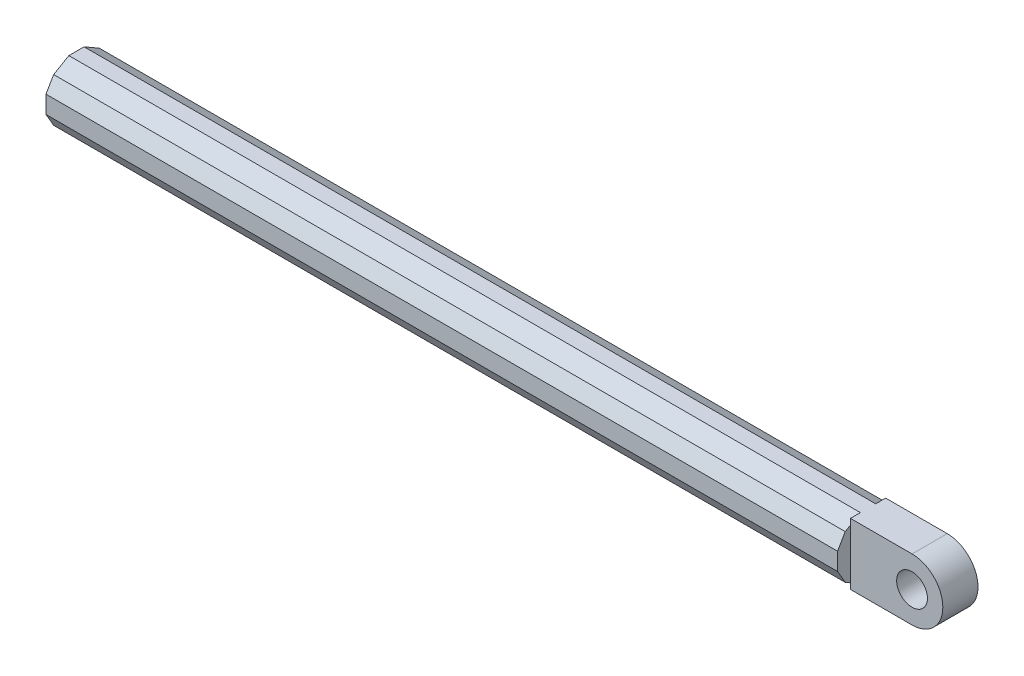
ISO-10303-21;
HEADER;
FILE_DESCRIPTION(('STEP AP214'),'2;1');
FILE_NAME('part.step','',(''),(''),'','','');
FILE_SCHEMA(('AUTOMOTIVE_DESIGN { 1 0 10303 214 1 1 1 1 }'));
ENDSEC;
DATA;
#1=APPLICATION_CONTEXT('core data for automotive mechanical design processes');
#2=APPLICATION_PROTOCOL_DEFINITION('international standard','automotive_design',2000,#1);
#3=PRODUCT_CONTEXT('',#1,'mechanical');
#4=PRODUCT('Part','Part','',(#3));
#5=PRODUCT_RELATED_PRODUCT_CATEGORY('part','',(#4));
#6=PRODUCT_DEFINITION_FORMATION('','',#4);
#7=PRODUCT_DEFINITION_CONTEXT('part definition',#1,'design');
#8=PRODUCT_DEFINITION('design','',#6,#7);
#9=PRODUCT_DEFINITION_SHAPE('','',#8);
#10=(LENGTH_UNIT() NAMED_UNIT(*) SI_UNIT(.MILLI.,.METRE.));
#11=(NAMED_UNIT(*) PLANE_ANGLE_UNIT() SI_UNIT($,.RADIAN.));
#12=(NAMED_UNIT(*) SI_UNIT($,.STERADIAN.) SOLID_ANGLE_UNIT());
#13=UNCERTAINTY_MEASURE_WITH_UNIT(LENGTH_MEASURE(1.E-05),#10,'distance_accuracy_value','');
#14=(GEOMETRIC_REPRESENTATION_CONTEXT(3) GLOBAL_UNCERTAINTY_ASSIGNED_CONTEXT((#13)) GLOBAL_UNIT_ASSIGNED_CONTEXT((#10,
#11,#12)) REPRESENTATION_CONTEXT('',''));
#15=CARTESIAN_POINT('',(0.,0.,0.));
#16=DIRECTION('',(0.,0.,1.));
#17=DIRECTION('',(1.,0.,0.));
#18=AXIS2_PLACEMENT_3D('',#15,#16,#17);
#19=CARTESIAN_POINT('',(90.,0.,0.));
#20=DIRECTION('',(1.,0.,0.));
#21=DIRECTION('',(0.,0.,-1.));
#22=AXIS2_PLACEMENT_3D('',#19,#20,#21);
#23=PLANE('',#22);
#24=DIRECTION('',(0.,0.5,0.866025403784438));
#25=VECTOR('',#24,1.);
#26=CARTESIAN_POINT('',(90.,2.,-3.46410161513775));
#27=LINE('',#26,#25);
#28=CARTESIAN_POINT('',(90.,2.49999999999999,-2.59807621135333));
#29=VERTEX_POINT('',#28);
#30=CARTESIAN_POINT('',(90.,2.84529946162075,-2.));
#31=VERTEX_POINT('',#30);
#32=EDGE_CURVE('E454',#29,#31,#27,.T.);
#33=ORIENTED_EDGE('',*,*,#32,.T.);
#34=DIRECTION('',(0.,-1.,0.));
#35=VECTOR('',#34,1.);
#36=CARTESIAN_POINT('',(90.,3.5,-2.));
#37=LINE('',#36,#35);
#38=CARTESIAN_POINT('',(90.,-2.84529946162075,-2.));
#39=VERTEX_POINT('',#38);
#40=EDGE_CURVE('E49',#31,#39,#37,.T.);
#41=ORIENTED_EDGE('',*,*,#40,.T.);
#42=DIRECTION('',(0.,0.5,-0.866025403784439));
#43=VECTOR('',#42,1.);
#44=CARTESIAN_POINT('',(90.,-4.,0.));
#45=LINE('',#44,#43);
#46=CARTESIAN_POINT('',(90.,-2.50000000000001,-2.5980762113533));
#47=VERTEX_POINT('',#46);
#48=EDGE_CURVE('E450',#39,#47,#45,.T.);
#49=ORIENTED_EDGE('',*,*,#48,.T.);
#50=DIRECTION('',(0.,-0.866025403784436,0.500000000000004));
#51=VECTOR('',#50,1.);
#52=CARTESIAN_POINT('',(90.,-1.75000000000001,-3.03108891324552));
#53=LINE('',#52,#51);
#54=CARTESIAN_POINT('',(90.,-1.00000000000001,-3.46410161513775));
#55=VERTEX_POINT('',#54);
#56=EDGE_CURVE('E505',#47,#55,#53,.F.);
#57=ORIENTED_EDGE('',*,*,#56,.T.);
#58=DIRECTION('',(0.,1.,0.));
#59=VECTOR('',#58,1.);
#60=CARTESIAN_POINT('',(90.,-2.,-3.46410161513775));
#61=LINE('',#60,#59);
#62=CARTESIAN_POINT('',(90.,1.,-3.46410161513775));
#63=VERTEX_POINT('',#62);
#64=EDGE_CURVE('E449',#55,#63,#61,.T.);
#65=ORIENTED_EDGE('',*,*,#64,.T.);
#66=DIRECTION('',(0.,-0.866025403784441,-0.499999999999996));
#67=VECTOR('',#66,1.);
#68=CARTESIAN_POINT('',(90.,1.74999999999999,-3.03108891324555));
#69=LINE('',#68,#67);
#70=EDGE_CURVE('E507',#63,#29,#69,.F.);
#71=ORIENTED_EDGE('',*,*,#70,.T.);
#72=EDGE_LOOP('',(#33,#41,#49,#57,#65,#71));
#73=FACE_BOUND('',#72,.T.);
#74=ADVANCED_FACE('F39',(#73),#23,.T.);
#75=CARTESIAN_POINT('',(0.,0.,0.));
#76=DIRECTION('',(1.,0.,0.));
#77=DIRECTION('',(0.,0.,-1.));
#78=AXIS2_PLACEMENT_3D('',#75,#76,#77);
#79=PLANE('',#78);
#80=DIRECTION('',(0.,-1.,0.));
#81=VECTOR('',#80,1.);
#82=CARTESIAN_POINT('',(0.,2.,3.46410161513775));
#83=LINE('',#82,#81);
#84=CARTESIAN_POINT('',(0.,0.999999999999997,3.46410161513775));
#85=VERTEX_POINT('',#84);
#86=CARTESIAN_POINT('',(0.,-0.999999999999993,3.46410161513775));
#87=VERTEX_POINT('',#86);
#88=EDGE_CURVE('E476',#85,#87,#83,.T.);
#89=ORIENTED_EDGE('',*,*,#88,.F.);
#90=DIRECTION('',(0.,-0.866025403784436,0.500000000000004));
#91=VECTOR('',#90,1.);
#92=CARTESIAN_POINT('',(0.,0.999999999999997,3.46410161513775));
#93=LINE('',#92,#91);
#94=CARTESIAN_POINT('',(0.,2.50000000000001,2.5980762113533));
#95=VERTEX_POINT('',#94);
#96=EDGE_CURVE('E496',#85,#95,#93,.F.);
#97=ORIENTED_EDGE('',*,*,#96,.T.);
#98=DIRECTION('',(0.,-0.5,0.866025403784439));
#99=VECTOR('',#98,1.);
#100=CARTESIAN_POINT('',(0.,4.,0.));
#101=LINE('',#100,#99);
#102=CARTESIAN_POINT('',(0.,3.5,0.866025403784446));
#103=VERTEX_POINT('',#102);
#104=EDGE_CURVE('E473',#103,#95,#101,.T.);
#105=ORIENTED_EDGE('',*,*,#104,.F.);
#106=DIRECTION('',(0.,0.,1.));
#107=VECTOR('',#106,1.);
#108=CARTESIAN_POINT('',(0.,3.5,0.866025403784446));
#109=LINE('',#108,#107);
#110=CARTESIAN_POINT('',(0.,3.49999999999999,-0.866025403784453));
#111=VERTEX_POINT('',#110);
#112=EDGE_CURVE('E494',#103,#111,#109,.F.);
#113=ORIENTED_EDGE('',*,*,#112,.T.);
#114=DIRECTION('',(0.,0.5,0.866025403784438));
#115=VECTOR('',#114,1.);
#116=CARTESIAN_POINT('',(0.,2.,-3.46410161513775));
#117=LINE('',#116,#115);
#118=CARTESIAN_POINT('',(0.,2.49999999999999,-2.59807621135333));
#119=VERTEX_POINT('',#118);
#120=EDGE_CURVE('E470',#119,#111,#117,.T.);
#121=ORIENTED_EDGE('',*,*,#120,.F.);
#122=DIRECTION('',(0.,0.866025403784441,0.499999999999996));
#123=VECTOR('',#122,1.);
#124=CARTESIAN_POINT('',(0.,2.49999999999999,-2.59807621135333));
#125=LINE('',#124,#123);
#126=CARTESIAN_POINT('',(0.,1.,-3.46410161513775));
#127=VERTEX_POINT('',#126);
#128=EDGE_CURVE('E492',#119,#127,#125,.F.);
#129=ORIENTED_EDGE('',*,*,#128,.T.);
#130=DIRECTION('',(0.,1.,0.));
#131=VECTOR('',#130,1.);
#132=CARTESIAN_POINT('',(0.,-2.,-3.46410161513775));
#133=LINE('',#132,#131);
#134=CARTESIAN_POINT('',(0.,-1.00000000000001,-3.46410161513775));
#135=VERTEX_POINT('',#134);
#136=EDGE_CURVE('E467',#135,#127,#133,.T.);
#137=ORIENTED_EDGE('',*,*,#136,.F.);
#138=DIRECTION('',(0.,0.866025403784436,-0.500000000000004));
#139=VECTOR('',#138,1.);
#140=CARTESIAN_POINT('',(0.,-1.00000000000001,-3.46410161513775));
#141=LINE('',#140,#139);
#142=CARTESIAN_POINT('',(0.,-2.50000000000001,-2.5980762113533));
#143=VERTEX_POINT('',#142);
#144=EDGE_CURVE('E490',#135,#143,#141,.F.);
#145=ORIENTED_EDGE('',*,*,#144,.T.);
#146=DIRECTION('',(0.,0.5,-0.866025403784439));
#147=VECTOR('',#146,1.);
#148=CARTESIAN_POINT('',(0.,-4.,0.));
#149=LINE('',#148,#147);
#150=CARTESIAN_POINT('',(0.,-3.5,-0.866025403784433));
#151=VERTEX_POINT('',#150);
#152=EDGE_CURVE('E411',#151,#143,#149,.T.);
#153=ORIENTED_EDGE('',*,*,#152,.F.);
#154=DIRECTION('',(0.,0.,-1.));
#155=VECTOR('',#154,1.);
#156=CARTESIAN_POINT('',(0.,-3.5,-0.866025403784433));
#157=LINE('',#156,#155);
#158=CARTESIAN_POINT('',(0.,-3.5,0.866025403784438));
#159=VERTEX_POINT('',#158);
#160=EDGE_CURVE('E486',#151,#159,#157,.F.);
#161=ORIENTED_EDGE('',*,*,#160,.T.);
#162=DIRECTION('',(0.,-0.5,-0.866025403784438));
#163=VECTOR('',#162,1.);
#164=CARTESIAN_POINT('',(0.,-2.,3.46410161513775));
#165=LINE('',#164,#163);
#166=CARTESIAN_POINT('',(0.,-2.49999999999999,2.59807621135333));
#167=VERTEX_POINT('',#166);
#168=EDGE_CURVE('E479',#167,#159,#165,.T.);
#169=ORIENTED_EDGE('',*,*,#168,.F.);
#170=DIRECTION('',(0.,-0.866025403784441,-0.499999999999995));
#171=VECTOR('',#170,1.);
#172=CARTESIAN_POINT('',(0.,-2.49999999999999,2.59807621135333));
#173=LINE('',#172,#171);
#174=EDGE_CURVE('E488',#167,#87,#173,.F.);
#175=ORIENTED_EDGE('',*,*,#174,.T.);
#176=EDGE_LOOP('',(#89,#97,#105,#113,#121,#129,#137,#145,#153,#161,#169,#175));
#177=FACE_BOUND('',#176,.T.);
#178=CARTESIAN_POINT('',(0.,2.056810333988,-1.18749999999989));
#179=DIRECTION('',(-1.,0.,0.));
#180=DIRECTION('',(0.,0.,1.));
#181=AXIS2_PLACEMENT_3D('',#178,#179,#180);
#182=CIRCLE('',#181,0.250000000000002);
#183=CARTESIAN_POINT('',(0.,1.93181033398809,-1.40400635094605));
#184=VERTEX_POINT('',#183);
#185=CARTESIAN_POINT('',(0.,2.18181033398808,-0.970993649053817));
#186=VERTEX_POINT('',#185);
#187=EDGE_CURVE('E327',#184,#186,#182,.T.);
#188=ORIENTED_EDGE('',*,*,#187,.T.);
#189=DIRECTION('',(0.,-0.499999999999971,-0.866025403784455));
#190=VECTOR('',#189,1.);
#191=CARTESIAN_POINT('',(0.,2.05681033398808,-1.18749999999993));
#192=LINE('',#191,#190);
#193=CARTESIAN_POINT('',(0.,2.74241377865072,0.));
#194=VERTEX_POINT('',#193);
#195=EDGE_CURVE('E335',#194,#186,#192,.T.);
#196=ORIENTED_EDGE('',*,*,#195,.F.);
#197=DIRECTION('',(0.,0.500000000000029,-0.866025403784422));
#198=VECTOR('',#197,1.);
#199=CARTESIAN_POINT('',(0.,2.056810333988,1.18750000000007));
#200=LINE('',#199,#198);
#201=CARTESIAN_POINT('',(0.,2.18181033398801,0.970993649053964));
#202=VERTEX_POINT('',#201);
#203=EDGE_CURVE('E406',#202,#194,#200,.T.);
#204=ORIENTED_EDGE('',*,*,#203,.F.);
#205=CARTESIAN_POINT('',(0.,2.056810333988,1.18750000000007));
#206=DIRECTION('',(-1.,0.,0.));
#207=DIRECTION('',(0.,0.,1.));
#208=AXIS2_PLACEMENT_3D('',#205,#206,#207);
#209=CIRCLE('',#208,0.25);
#210=CARTESIAN_POINT('',(0.,1.93181033398799,1.40400635094618));
#211=VERTEX_POINT('',#210);
#212=EDGE_CURVE('E405',#202,#211,#209,.T.);
#213=ORIENTED_EDGE('',*,*,#212,.T.);
#214=CARTESIAN_POINT('',(0.,1.37120688932528,2.37500000000005));
#215=VERTEX_POINT('',#214);
#216=EDGE_CURVE('E402',#215,#211,#200,.T.);
#217=ORIENTED_EDGE('',*,*,#216,.F.);
#218=DIRECTION('',(0.,1.,0.));
#219=VECTOR('',#218,1.);
#220=CARTESIAN_POINT('',(0.,0.,2.375));
#221=LINE('',#220,#219);
#222=CARTESIAN_POINT('',(0.,0.25,2.37500000000001));
#223=VERTEX_POINT('',#222);
#224=EDGE_CURVE('E399',#223,#215,#221,.T.);
#225=ORIENTED_EDGE('',*,*,#224,.F.);
#226=CARTESIAN_POINT('',(0.,0.,2.37500000000005));
#227=DIRECTION('',(-1.,0.,0.));
#228=DIRECTION('',(0.,0.,1.));
#229=AXIS2_PLACEMENT_3D('',#226,#227,#228);
#230=CIRCLE('',#229,0.25);
#231=CARTESIAN_POINT('',(0.,-0.25,2.37499999999999));
#232=VERTEX_POINT('',#231);
#233=EDGE_CURVE('E398',#223,#232,#230,.T.);
#234=ORIENTED_EDGE('',*,*,#233,.T.);
#235=CARTESIAN_POINT('',(0.,-1.37120688932544,2.37499999999995));
#236=VERTEX_POINT('',#235);
#237=EDGE_CURVE('E395',#236,#232,#221,.T.);
#238=ORIENTED_EDGE('',*,*,#237,.F.);
#239=DIRECTION('',(0.,0.499999999999971,0.866025403784456));
#240=VECTOR('',#239,1.);
#241=CARTESIAN_POINT('',(0.,-2.05681033398808,1.18749999999993));
#242=LINE('',#241,#240);
#243=CARTESIAN_POINT('',(0.,-1.93181033398801,1.40400635094618));
#244=VERTEX_POINT('',#243);
#245=EDGE_CURVE('E392',#244,#236,#242,.T.);
#246=ORIENTED_EDGE('',*,*,#245,.F.);
#247=CARTESIAN_POINT('',(0.,-2.056810333988,1.18750000000007));
#248=DIRECTION('',(-1.,0.,0.));
#249=DIRECTION('',(0.,0.,1.));
#250=AXIS2_PLACEMENT_3D('',#247,#248,#249);
#251=CIRCLE('',#250,0.25);
#252=CARTESIAN_POINT('',(0.,-2.181810333988,0.970993649053953));
#253=VERTEX_POINT('',#252);
#254=EDGE_CURVE('E391',#244,#253,#251,.T.);
#255=ORIENTED_EDGE('',*,*,#254,.T.);
#256=CARTESIAN_POINT('',(0.,-2.74241377865072,0.));
#257=VERTEX_POINT('',#256);
#258=EDGE_CURVE('E388',#257,#253,#242,.T.);
#259=ORIENTED_EDGE('',*,*,#258,.F.);
#260=DIRECTION('',(0.,-0.500000000000029,0.866025403784422));
#261=VECTOR('',#260,1.);
#262=CARTESIAN_POINT('',(0.,-2.056810333988,-1.18750000000007));
#263=LINE('',#262,#261);
#264=CARTESIAN_POINT('',(0.,-2.18181033398809,-0.970993649053829));
#265=VERTEX_POINT('',#264);
#266=EDGE_CURVE('E385',#265,#257,#263,.T.);
#267=ORIENTED_EDGE('',*,*,#266,.F.);
#268=CARTESIAN_POINT('',(0.,-2.056810333988,-1.18749999999989));
#269=DIRECTION('',(-1.,0.,0.));
#270=DIRECTION('',(0.,0.,1.));
#271=AXIS2_PLACEMENT_3D('',#268,#269,#270);
#272=CIRCLE('',#271,0.25);
#273=CARTESIAN_POINT('',(0.,-1.93181033398807,-1.40400635094604));
#274=VERTEX_POINT('',#273);
#275=EDGE_CURVE('E384',#265,#274,#272,.T.);
#276=ORIENTED_EDGE('',*,*,#275,.T.);
#277=CARTESIAN_POINT('',(0.,-1.37120688932528,-2.37500000000005));
#278=VERTEX_POINT('',#277);
#279=EDGE_CURVE('E381',#278,#274,#263,.T.);
#280=ORIENTED_EDGE('',*,*,#279,.F.);
#281=DIRECTION('',(0.,-1.,0.));
#282=VECTOR('',#281,1.);
#283=CARTESIAN_POINT('',(0.,0.,-2.375));
#284=LINE('',#283,#282);
#285=CARTESIAN_POINT('',(0.,-0.249999999999997,-2.37500000000001));
#286=VERTEX_POINT('',#285);
#287=EDGE_CURVE('E378',#286,#278,#284,.T.);
#288=ORIENTED_EDGE('',*,*,#287,.F.);
#289=CARTESIAN_POINT('',(0.,0.,-2.37499999999986));
#290=DIRECTION('',(-1.,0.,0.));
#291=DIRECTION('',(0.,0.,1.));
#292=AXIS2_PLACEMENT_3D('',#289,#290,#291);
#293=CIRCLE('',#292,0.25);
#294=CARTESIAN_POINT('',(0.,0.250000000000003,-2.37499999999999));
#295=VERTEX_POINT('',#294);
#296=EDGE_CURVE('E377',#286,#295,#293,.T.);
#297=ORIENTED_EDGE('',*,*,#296,.T.);
#298=CARTESIAN_POINT('',(0.,1.37120688932544,-2.37499999999995));
#299=VERTEX_POINT('',#298);
#300=EDGE_CURVE('E374',#299,#295,#284,.T.);
#301=ORIENTED_EDGE('',*,*,#300,.F.);
#302=EDGE_CURVE('E371',#184,#299,#192,.T.);
#303=ORIENTED_EDGE('',*,*,#302,.F.);
#304=EDGE_LOOP('',(#188,#196,#204,#213,#217,#225,#234,#238,#246,#255,#259,#267,#276,#280,#288,
#297,#301,#303));
#305=FACE_BOUND('',#304,.T.);
#306=ADVANCED_FACE('F567',(#177,#305),#79,.F.);
#307=CARTESIAN_POINT('',(90.,-4.,0.));
#308=DIRECTION('',(0.,0.866025403784439,0.5));
#309=DIRECTION('',(0.,-0.5,0.866025403784439));
#310=AXIS2_PLACEMENT_3D('',#307,#308,#309);
#311=PLANE('',#310);
#312=ORIENTED_EDGE('',*,*,#152,.T.);
#313=DIRECTION('',(1.,0.,0.));
#314=VECTOR('',#313,1.);
#315=CARTESIAN_POINT('',(90.,-2.50000000000001,-2.5980762113533));
#316=LINE('',#315,#314);
#317=EDGE_CURVE('E525',#143,#47,#316,.T.);
#318=ORIENTED_EDGE('',*,*,#317,.T.);
#319=ORIENTED_EDGE('',*,*,#48,.F.);
#320=CARTESIAN_POINT('',(90.,-3.49999999999999,-0.866025403784449));
#321=VERTEX_POINT('',#320);
#322=EDGE_CURVE('E447',#321,#39,#45,.T.);
#323=ORIENTED_EDGE('',*,*,#322,.F.);
#324=DIRECTION('',(-1.,0.,0.));
#325=VECTOR('',#324,1.);
#326=CARTESIAN_POINT('',(90.,-3.5,-0.866025403784433));
#327=LINE('',#326,#325);
#328=EDGE_CURVE('E522',#321,#151,#327,.T.);
#329=ORIENTED_EDGE('',*,*,#328,.T.);
#330=EDGE_LOOP('',(#312,#318,#319,#323,#329));
#331=FACE_BOUND('',#330,.T.);
#332=ADVANCED_FACE('F598',(#331),#311,.F.);
#333=CARTESIAN_POINT('',(90.,-2.,-3.46410161513775));
#334=DIRECTION('',(0.,0.,1.));
#335=DIRECTION('',(1.,0.,0.));
#336=AXIS2_PLACEMENT_3D('',#333,#334,#335);
#337=PLANE('',#336);
#338=ORIENTED_EDGE('',*,*,#136,.T.);
#339=DIRECTION('',(1.,0.,0.));
#340=VECTOR('',#339,1.);
#341=CARTESIAN_POINT('',(90.,1.,-3.46410161513775));
#342=LINE('',#341,#340);
#343=EDGE_CURVE('E520',#127,#63,#342,.T.);
#344=ORIENTED_EDGE('',*,*,#343,.T.);
#345=ORIENTED_EDGE('',*,*,#64,.F.);
#346=DIRECTION('',(-1.,0.,0.));
#347=VECTOR('',#346,1.);
#348=CARTESIAN_POINT('',(90.,-1.00000000000001,-3.46410161513775));
#349=LINE('',#348,#347);
#350=EDGE_CURVE('E517',#55,#135,#349,.T.);
#351=ORIENTED_EDGE('',*,*,#350,.T.);
#352=EDGE_LOOP('',(#338,#344,#345,#351));
#353=FACE_BOUND('',#352,.T.);
#354=ADVANCED_FACE('F590',(#353),#337,.F.);
#355=CARTESIAN_POINT('',(90.,2.,-3.46410161513775));
#356=DIRECTION('',(0.,-0.866025403784438,0.5));
#357=DIRECTION('',(0.,-0.5,-0.866025403784439));
#358=AXIS2_PLACEMENT_3D('',#355,#356,#357);
#359=PLANE('',#358);
#360=ORIENTED_EDGE('',*,*,#120,.T.);
#361=DIRECTION('',(1.,0.,0.));
#362=VECTOR('',#361,1.);
#363=CARTESIAN_POINT('',(90.,3.49999999999999,-0.866025403784452));
#364=LINE('',#363,#362);
#365=CARTESIAN_POINT('',(90.,3.5,-0.866025403784448));
#366=VERTEX_POINT('',#365);
#367=EDGE_CURVE('E514',#111,#366,#364,.T.);
#368=ORIENTED_EDGE('',*,*,#367,.T.);
#369=EDGE_CURVE('E453',#31,#366,#27,.T.);
#370=ORIENTED_EDGE('',*,*,#369,.F.);
#371=ORIENTED_EDGE('',*,*,#32,.F.);
#372=DIRECTION('',(-1.,0.,0.));
#373=VECTOR('',#372,1.);
#374=CARTESIAN_POINT('',(90.,2.49999999999999,-2.59807621135333));
#375=LINE('',#374,#373);
#376=EDGE_CURVE('E511',#29,#119,#375,.T.);
#377=ORIENTED_EDGE('',*,*,#376,.T.);
#378=EDGE_LOOP('',(#360,#368,#370,#371,#377));
#379=FACE_BOUND('',#378,.T.);
#380=ADVANCED_FACE('F577',(#379),#359,.F.);
#381=CARTESIAN_POINT('',(90.,4.,0.));
#382=DIRECTION('',(0.,-0.866025403784439,-0.5));
#383=DIRECTION('',(0.,0.5,-0.866025403784439));
#384=AXIS2_PLACEMENT_3D('',#381,#382,#383);
#385=PLANE('',#384);
#386=ORIENTED_EDGE('',*,*,#104,.T.);
#387=DIRECTION('',(1.,0.,0.));
#388=VECTOR('',#387,1.);
#389=CARTESIAN_POINT('',(90.,2.50000000000001,2.5980762113533));
#390=LINE('',#389,#388);
#391=CARTESIAN_POINT('',(90.,2.50000000000001,2.5980762113533));
#392=VERTEX_POINT('',#391);
#393=EDGE_CURVE('E501',#95,#392,#390,.T.);
#394=ORIENTED_EDGE('',*,*,#393,.T.);
#395=DIRECTION('',(0.,-0.5,0.866025403784439));
#396=VECTOR('',#395,1.);
#397=CARTESIAN_POINT('',(90.,4.,0.));
#398=LINE('',#397,#396);
#399=CARTESIAN_POINT('',(90.,2.84529946162075,2.));
#400=VERTEX_POINT('',#399);
#401=EDGE_CURVE('E457',#400,#392,#398,.T.);
#402=ORIENTED_EDGE('',*,*,#401,.F.);
#403=CARTESIAN_POINT('',(90.,3.5,0.866025403784447));
#404=VERTEX_POINT('',#403);
#405=EDGE_CURVE('E458',#404,#400,#398,.T.);
#406=ORIENTED_EDGE('',*,*,#405,.F.);
#407=DIRECTION('',(-1.,0.,0.));
#408=VECTOR('',#407,1.);
#409=CARTESIAN_POINT('',(90.,3.5,0.866025403784447));
#410=LINE('',#409,#408);
#411=EDGE_CURVE('E498',#404,#103,#410,.T.);
#412=ORIENTED_EDGE('',*,*,#411,.T.);
#413=EDGE_LOOP('',(#386,#394,#402,#406,#412));
#414=FACE_BOUND('',#413,.T.);
#415=ADVANCED_FACE('F555',(#414),#385,.F.);
#416=CARTESIAN_POINT('',(90.,2.,3.46410161513775));
#417=DIRECTION('',(0.,0.,-1.));
#418=DIRECTION('',(0.,1.,0.));
#419=AXIS2_PLACEMENT_3D('',#416,#417,#418);
#420=PLANE('',#419);
#421=DIRECTION('',(0.,-1.,0.));
#422=VECTOR('',#421,1.);
#423=CARTESIAN_POINT('',(90.,2.,3.46410161513775));
#424=LINE('',#423,#422);
#425=CARTESIAN_POINT('',(90.,0.999999999999997,3.46410161513775));
#426=VERTEX_POINT('',#425);
#427=CARTESIAN_POINT('',(90.,-0.999999999999993,3.46410161513775));
#428=VERTEX_POINT('',#427);
#429=EDGE_CURVE('E460',#426,#428,#424,.T.);
#430=ORIENTED_EDGE('',*,*,#429,.F.);
#431=DIRECTION('',(-1.,0.,0.));
#432=VECTOR('',#431,1.);
#433=CARTESIAN_POINT('',(90.,0.999999999999997,3.46410161513775));
#434=LINE('',#433,#432);
#435=EDGE_CURVE('E483',#426,#85,#434,.T.);
#436=ORIENTED_EDGE('',*,*,#435,.T.);
#437=ORIENTED_EDGE('',*,*,#88,.T.);
#438=DIRECTION('',(1.,0.,0.));
#439=VECTOR('',#438,1.);
#440=CARTESIAN_POINT('',(90.,-0.999999999999993,3.46410161513775));
#441=LINE('',#440,#439);
#442=EDGE_CURVE('E464',#87,#428,#441,.T.);
#443=ORIENTED_EDGE('',*,*,#442,.T.);
#444=EDGE_LOOP('',(#430,#436,#437,#443));
#445=FACE_BOUND('',#444,.T.);
#446=ADVANCED_FACE('F570',(#445),#420,.F.);
#447=CARTESIAN_POINT('',(90.,-2.,3.46410161513775));
#448=DIRECTION('',(0.,0.866025403784438,-0.5));
#449=DIRECTION('',(0.,0.5,0.866025403784439));
#450=AXIS2_PLACEMENT_3D('',#447,#448,#449);
#451=PLANE('',#450);
#452=DIRECTION('',(0.,-0.5,-0.866025403784438));
#453=VECTOR('',#452,1.);
#454=CARTESIAN_POINT('',(90.,-2.,3.46410161513775));
#455=LINE('',#454,#453);
#456=CARTESIAN_POINT('',(90.,-2.49999999999999,2.59807621135333));
#457=VERTEX_POINT('',#456);
#458=CARTESIAN_POINT('',(90.,-2.84529946162075,2.));
#459=VERTEX_POINT('',#458);
#460=EDGE_CURVE('E462',#457,#459,#455,.T.);
#461=ORIENTED_EDGE('',*,*,#460,.F.);
#462=DIRECTION('',(-1.,0.,0.));
#463=VECTOR('',#462,1.);
#464=CARTESIAN_POINT('',(90.,-2.49999999999999,2.59807621135333));
#465=LINE('',#464,#463);
#466=EDGE_CURVE('E44',#457,#167,#465,.T.);
#467=ORIENTED_EDGE('',*,*,#466,.T.);
#468=ORIENTED_EDGE('',*,*,#168,.T.);
#469=DIRECTION('',(1.,0.,0.));
#470=VECTOR('',#469,1.);
#471=CARTESIAN_POINT('',(90.,-3.5,0.866025403784437));
#472=LINE('',#471,#470);
#473=CARTESIAN_POINT('',(90.,-3.49999999999999,0.866025403784449));
#474=VERTEX_POINT('',#473);
#475=EDGE_CURVE('E527',#159,#474,#472,.T.);
#476=ORIENTED_EDGE('',*,*,#475,.T.);
#477=EDGE_CURVE('E293',#459,#474,#455,.T.);
#478=ORIENTED_EDGE('',*,*,#477,.F.);
#479=EDGE_LOOP('',(#461,#467,#468,#476,#478));
#480=FACE_BOUND('',#479,.T.);
#481=ADVANCED_FACE('F561',(#480),#451,.F.);
#482=DIRECTION('',(0.,-1.,0.));
#483=VECTOR('',#482,1.);
#484=CARTESIAN_POINT('',(90.,3.5,2.));
#485=LINE('',#484,#483);
#486=EDGE_CURVE('E11',#400,#459,#485,.T.);
#487=ORIENTED_EDGE('',*,*,#486,.F.);
#488=ORIENTED_EDGE('',*,*,#401,.T.);
#489=DIRECTION('',(0.,0.866025403784436,-0.500000000000004));
#490=VECTOR('',#489,1.);
#491=CARTESIAN_POINT('',(90.,1.75000000000001,3.03108891324552));
#492=LINE('',#491,#490);
#493=EDGE_CURVE('E509',#392,#426,#492,.F.);
#494=ORIENTED_EDGE('',*,*,#493,.T.);
#495=ORIENTED_EDGE('',*,*,#429,.T.);
#496=DIRECTION('',(0.,0.866025403784441,0.499999999999995));
#497=VECTOR('',#496,1.);
#498=CARTESIAN_POINT('',(90.,-1.74999999999998,3.03108891324555));
#499=LINE('',#498,#497);
#500=EDGE_CURVE('E67',#428,#457,#499,.F.);
#501=ORIENTED_EDGE('',*,*,#500,.T.);
#502=ORIENTED_EDGE('',*,*,#460,.T.);
#503=EDGE_LOOP('',(#487,#488,#494,#495,#501,#502));
#504=FACE_BOUND('',#503,.T.);
#505=ADVANCED_FACE('F559',(#504),#23,.T.);
#506=CARTESIAN_POINT('',(10.,2.056810333988,-1.18749999999989));
#507=DIRECTION('',(-1.,0.,0.));
#508=DIRECTION('',(0.,0.,1.));
#509=AXIS2_PLACEMENT_3D('',#506,#507,#508);
#510=CYLINDRICAL_SURFACE('',#509,0.250000000000002);
#511=ORIENTED_EDGE('',*,*,#187,.F.);
#512=DIRECTION('',(-1.,0.,0.));
#513=VECTOR('',#512,1.);
#514=CARTESIAN_POINT('',(10.,1.93181033398809,-1.40400635094605));
#515=LINE('',#514,#513);
#516=CARTESIAN_POINT('',(10.,1.93181033398809,-1.40400635094605));
#517=VERTEX_POINT('',#516);
#518=EDGE_CURVE('E444',#517,#184,#515,.T.);
#519=ORIENTED_EDGE('',*,*,#518,.F.);
#520=CARTESIAN_POINT('',(10.,2.056810333988,-1.18749999999989));
#521=DIRECTION('',(-1.,0.,0.));
#522=DIRECTION('',(0.,0.,1.));
#523=AXIS2_PLACEMENT_3D('',#520,#521,#522);
#524=CIRCLE('',#523,0.250000000000002);
#525=CARTESIAN_POINT('',(10.,2.18181033398808,-0.970993649053817));
#526=VERTEX_POINT('',#525);
#527=EDGE_CURVE('E332',#517,#526,#524,.T.);
#528=ORIENTED_EDGE('',*,*,#527,.T.);
#529=DIRECTION('',(-1.,0.,0.));
#530=VECTOR('',#529,1.);
#531=CARTESIAN_POINT('',(10.,2.18181033398808,-0.970993649053817));
#532=LINE('',#531,#530);
#533=EDGE_CURVE('E409',#526,#186,#532,.T.);
#534=ORIENTED_EDGE('',*,*,#533,.T.);
#535=EDGE_LOOP('',(#511,#519,#528,#534));
#536=FACE_BOUND('',#535,.T.);
#537=ADVANCED_FACE('F614',(#536),#510,.T.);
#538=CARTESIAN_POINT('',(10.,2.05681033398808,-1.18749999999993));
#539=DIRECTION('',(0.,0.866025403784455,-0.499999999999971));
#540=DIRECTION('',(0.,0.499999999999971,0.866025403784455));
#541=AXIS2_PLACEMENT_3D('',#538,#539,#540);
#542=PLANE('',#541);
#543=ORIENTED_EDGE('',*,*,#195,.T.);
#544=ORIENTED_EDGE('',*,*,#533,.F.);
#545=DIRECTION('',(0.,-0.499999999999971,-0.866025403784455));
#546=VECTOR('',#545,1.);
#547=CARTESIAN_POINT('',(10.,2.05681033398808,-1.18749999999993));
#548=LINE('',#547,#546);
#549=CARTESIAN_POINT('',(10.,2.74241377865072,0.));
#550=VERTEX_POINT('',#549);
#551=EDGE_CURVE('E339',#550,#526,#548,.T.);
#552=ORIENTED_EDGE('',*,*,#551,.F.);
#553=DIRECTION('',(-1.,0.,0.));
#554=VECTOR('',#553,1.);
#555=CARTESIAN_POINT('',(10.,2.74241377865072,0.));
#556=LINE('',#555,#554);
#557=EDGE_CURVE('E412',#550,#194,#556,.T.);
#558=ORIENTED_EDGE('',*,*,#557,.T.);
#559=EDGE_LOOP('',(#543,#544,#552,#558));
#560=FACE_BOUND('',#559,.T.);
#561=ADVANCED_FACE('F619',(#560),#542,.F.);
#562=CARTESIAN_POINT('',(10.,2.056810333988,1.18750000000007));
#563=DIRECTION('',(0.,0.866025403784422,0.500000000000029));
#564=DIRECTION('',(0.,-0.500000000000029,0.866025403784422));
#565=AXIS2_PLACEMENT_3D('',#562,#563,#564);
#566=PLANE('',#565);
#567=ORIENTED_EDGE('',*,*,#203,.T.);
#568=ORIENTED_EDGE('',*,*,#557,.F.);
#569=DIRECTION('',(0.,0.500000000000029,-0.866025403784422));
#570=VECTOR('',#569,1.);
#571=CARTESIAN_POINT('',(10.,2.056810333988,1.18750000000007));
#572=LINE('',#571,#570);
#573=CARTESIAN_POINT('',(10.,2.18181033398801,0.970993649053964));
#574=VERTEX_POINT('',#573);
#575=EDGE_CURVE('E367',#574,#550,#572,.T.);
#576=ORIENTED_EDGE('',*,*,#575,.F.);
#577=DIRECTION('',(-1.,0.,0.));
#578=VECTOR('',#577,1.);
#579=CARTESIAN_POINT('',(10.,2.18181033398801,0.970993649053964));
#580=LINE('',#579,#578);
#581=EDGE_CURVE('E414',#574,#202,#580,.T.);
#582=ORIENTED_EDGE('',*,*,#581,.T.);
#583=EDGE_LOOP('',(#567,#568,#576,#582));
#584=FACE_BOUND('',#583,.T.);
#585=ADVANCED_FACE('F744',(#584),#566,.F.);
#586=CARTESIAN_POINT('',(10.,2.056810333988,1.18750000000007));
#587=DIRECTION('',(-1.,0.,0.));
#588=DIRECTION('',(0.,0.,1.));
#589=AXIS2_PLACEMENT_3D('',#586,#587,#588);
#590=CYLINDRICAL_SURFACE('',#589,0.25);
#591=ORIENTED_EDGE('',*,*,#212,.F.);
#592=ORIENTED_EDGE('',*,*,#581,.F.);
#593=CARTESIAN_POINT('',(10.,2.056810333988,1.18750000000007));
#594=DIRECTION('',(-1.,0.,0.));
#595=DIRECTION('',(0.,0.,1.));
#596=AXIS2_PLACEMENT_3D('',#593,#594,#595);
#597=CIRCLE('',#596,0.25);
#598=CARTESIAN_POINT('',(10.,1.93181033398799,1.40400635094618));
#599=VERTEX_POINT('',#598);
#600=EDGE_CURVE('E366',#574,#599,#597,.T.);
#601=ORIENTED_EDGE('',*,*,#600,.T.);
#602=DIRECTION('',(-1.,0.,0.));
#603=VECTOR('',#602,1.);
#604=CARTESIAN_POINT('',(10.,1.93181033398799,1.40400635094618));
#605=LINE('',#604,#603);
#606=EDGE_CURVE('E416',#599,#211,#605,.T.);
#607=ORIENTED_EDGE('',*,*,#606,.T.);
#608=EDGE_LOOP('',(#591,#592,#601,#607));
#609=FACE_BOUND('',#608,.T.);
#610=ADVANCED_FACE('F755',(#609),#590,.T.);
#611=ORIENTED_EDGE('',*,*,#216,.T.);
#612=ORIENTED_EDGE('',*,*,#606,.F.);
#613=CARTESIAN_POINT('',(10.,1.37120688932528,2.37500000000005));
#614=VERTEX_POINT('',#613);
#615=EDGE_CURVE('E363',#614,#599,#572,.T.);
#616=ORIENTED_EDGE('',*,*,#615,.F.);
#617=DIRECTION('',(-1.,0.,0.));
#618=VECTOR('',#617,1.);
#619=CARTESIAN_POINT('',(10.,1.37120688932528,2.37500000000005));
#620=LINE('',#619,#618);
#621=EDGE_CURVE('E418',#614,#215,#620,.T.);
#622=ORIENTED_EDGE('',*,*,#621,.T.);
#623=EDGE_LOOP('',(#611,#612,#616,#622));
#624=FACE_BOUND('',#623,.T.);
#625=ADVANCED_FACE('F758',(#624),#566,.F.);
#626=CARTESIAN_POINT('',(10.,0.,2.375));
#627=DIRECTION('',(0.,0.,1.));
#628=DIRECTION('',(0.,-1.,0.));
#629=AXIS2_PLACEMENT_3D('',#626,#627,#628);
#630=PLANE('',#629);
#631=ORIENTED_EDGE('',*,*,#224,.T.);
#632=ORIENTED_EDGE('',*,*,#621,.F.);
#633=DIRECTION('',(0.,1.,0.));
#634=VECTOR('',#633,1.);
#635=CARTESIAN_POINT('',(10.,0.,2.375));
#636=LINE('',#635,#634);
#637=CARTESIAN_POINT('',(10.,0.25,2.37500000000001));
#638=VERTEX_POINT('',#637);
#639=EDGE_CURVE('E361',#638,#614,#636,.T.);
#640=ORIENTED_EDGE('',*,*,#639,.F.);
#641=DIRECTION('',(-1.,0.,0.));
#642=VECTOR('',#641,1.);
#643=CARTESIAN_POINT('',(10.,0.25,2.37500000000001));
#644=LINE('',#643,#642);
#645=EDGE_CURVE('E420',#638,#223,#644,.T.);
#646=ORIENTED_EDGE('',*,*,#645,.T.);
#647=EDGE_LOOP('',(#631,#632,#640,#646));
#648=FACE_BOUND('',#647,.T.);
#649=ADVANCED_FACE('F775',(#648),#630,.F.);
#650=CARTESIAN_POINT('',(10.,0.,2.37500000000005));
#651=DIRECTION('',(-1.,0.,0.));
#652=DIRECTION('',(0.,0.,1.));
#653=AXIS2_PLACEMENT_3D('',#650,#651,#652);
#654=CYLINDRICAL_SURFACE('',#653,0.25);
#655=ORIENTED_EDGE('',*,*,#233,.F.);
#656=ORIENTED_EDGE('',*,*,#645,.F.);
#657=CARTESIAN_POINT('',(10.,0.,2.37500000000005));
#658=DIRECTION('',(-1.,0.,0.));
#659=DIRECTION('',(0.,0.,1.));
#660=AXIS2_PLACEMENT_3D('',#657,#658,#659);
#661=CIRCLE('',#660,0.25);
#662=CARTESIAN_POINT('',(10.,-0.25,2.37499999999999));
#663=VERTEX_POINT('',#662);
#664=EDGE_CURVE('E360',#638,#663,#661,.T.);
#665=ORIENTED_EDGE('',*,*,#664,.T.);
#666=DIRECTION('',(-1.,0.,0.));
#667=VECTOR('',#666,1.);
#668=CARTESIAN_POINT('',(10.,-0.25,2.37499999999999));
#669=LINE('',#668,#667);
#670=EDGE_CURVE('E422',#663,#232,#669,.T.);
#671=ORIENTED_EDGE('',*,*,#670,.T.);
#672=EDGE_LOOP('',(#655,#656,#665,#671));
#673=FACE_BOUND('',#672,.T.);
#674=ADVANCED_FACE('F784',(#673),#654,.T.);
#675=ORIENTED_EDGE('',*,*,#237,.T.);
#676=ORIENTED_EDGE('',*,*,#670,.F.);
#677=CARTESIAN_POINT('',(10.,-1.37120688932544,2.37499999999995));
#678=VERTEX_POINT('',#677);
#679=EDGE_CURVE('E357',#678,#663,#636,.T.);
#680=ORIENTED_EDGE('',*,*,#679,.F.);
#681=DIRECTION('',(-1.,0.,0.));
#682=VECTOR('',#681,1.);
#683=CARTESIAN_POINT('',(10.,-1.37120688932544,2.37499999999995));
#684=LINE('',#683,#682);
#685=EDGE_CURVE('E424',#678,#236,#684,.T.);
#686=ORIENTED_EDGE('',*,*,#685,.T.);
#687=EDGE_LOOP('',(#675,#676,#680,#686));
#688=FACE_BOUND('',#687,.T.);
#689=ADVANCED_FACE('F787',(#688),#630,.F.);
#690=CARTESIAN_POINT('',(10.,-2.05681033398808,1.18749999999993));
#691=DIRECTION('',(0.,-0.866025403784456,0.499999999999971));
#692=DIRECTION('',(0.,-0.499999999999971,-0.866025403784456));
#693=AXIS2_PLACEMENT_3D('',#690,#691,#692);
#694=PLANE('',#693);
#695=ORIENTED_EDGE('',*,*,#245,.T.);
#696=ORIENTED_EDGE('',*,*,#685,.F.);
#697=DIRECTION('',(0.,0.499999999999971,0.866025403784456));
#698=VECTOR('',#697,1.);
#699=CARTESIAN_POINT('',(10.,-2.05681033398808,1.18749999999993));
#700=LINE('',#699,#698);
#701=CARTESIAN_POINT('',(10.,-1.93181033398801,1.40400635094618));
#702=VERTEX_POINT('',#701);
#703=EDGE_CURVE('E355',#702,#678,#700,.T.);
#704=ORIENTED_EDGE('',*,*,#703,.F.);
#705=DIRECTION('',(-1.,0.,0.));
#706=VECTOR('',#705,1.);
#707=CARTESIAN_POINT('',(10.,-1.93181033398801,1.40400635094618));
#708=LINE('',#707,#706);
#709=EDGE_CURVE('E426',#702,#244,#708,.T.);
#710=ORIENTED_EDGE('',*,*,#709,.T.);
#711=EDGE_LOOP('',(#695,#696,#704,#710));
#712=FACE_BOUND('',#711,.T.);
#713=ADVANCED_FACE('F804',(#712),#694,.F.);
#714=CARTESIAN_POINT('',(10.,-2.056810333988,1.18750000000007));
#715=DIRECTION('',(-1.,0.,0.));
#716=DIRECTION('',(0.,0.,1.));
#717=AXIS2_PLACEMENT_3D('',#714,#715,#716);
#718=CYLINDRICAL_SURFACE('',#717,0.25);
#719=ORIENTED_EDGE('',*,*,#254,.F.);
#720=ORIENTED_EDGE('',*,*,#709,.F.);
#721=CARTESIAN_POINT('',(10.,-2.056810333988,1.18750000000007));
#722=DIRECTION('',(-1.,0.,0.));
#723=DIRECTION('',(0.,0.,1.));
#724=AXIS2_PLACEMENT_3D('',#721,#722,#723);
#725=CIRCLE('',#724,0.25);
#726=CARTESIAN_POINT('',(10.,-2.181810333988,0.970993649053953));
#727=VERTEX_POINT('',#726);
#728=EDGE_CURVE('E354',#702,#727,#725,.T.);
#729=ORIENTED_EDGE('',*,*,#728,.T.);
#730=DIRECTION('',(-1.,0.,0.));
#731=VECTOR('',#730,1.);
#732=CARTESIAN_POINT('',(10.,-2.181810333988,0.970993649053953));
#733=LINE('',#732,#731);
#734=EDGE_CURVE('E428',#727,#253,#733,.T.);
#735=ORIENTED_EDGE('',*,*,#734,.T.);
#736=EDGE_LOOP('',(#719,#720,#729,#735));
#737=FACE_BOUND('',#736,.T.);
#738=ADVANCED_FACE('F813',(#737),#718,.T.);
#739=ORIENTED_EDGE('',*,*,#258,.T.);
#740=ORIENTED_EDGE('',*,*,#734,.F.);
#741=CARTESIAN_POINT('',(10.,-2.74241377865072,0.));
#742=VERTEX_POINT('',#741);
#743=EDGE_CURVE('E351',#742,#727,#700,.T.);
#744=ORIENTED_EDGE('',*,*,#743,.F.);
#745=DIRECTION('',(-1.,0.,0.));
#746=VECTOR('',#745,1.);
#747=CARTESIAN_POINT('',(10.,-2.74241377865072,0.));
#748=LINE('',#747,#746);
#749=EDGE_CURVE('E430',#742,#257,#748,.T.);
#750=ORIENTED_EDGE('',*,*,#749,.T.);
#751=EDGE_LOOP('',(#739,#740,#744,#750));
#752=FACE_BOUND('',#751,.T.);
#753=ADVANCED_FACE('F816',(#752),#694,.F.);
#754=CARTESIAN_POINT('',(10.,-2.056810333988,-1.18750000000007));
#755=DIRECTION('',(0.,-0.866025403784422,-0.500000000000029));
#756=DIRECTION('',(0.,0.500000000000029,-0.866025403784422));
#757=AXIS2_PLACEMENT_3D('',#754,#755,#756);
#758=PLANE('',#757);
#759=ORIENTED_EDGE('',*,*,#266,.T.);
#760=ORIENTED_EDGE('',*,*,#749,.F.);
#761=DIRECTION('',(0.,-0.500000000000029,0.866025403784422));
#762=VECTOR('',#761,1.);
#763=CARTESIAN_POINT('',(10.,-2.056810333988,-1.18750000000007));
#764=LINE('',#763,#762);
#765=CARTESIAN_POINT('',(10.,-2.18181033398809,-0.970993649053829));
#766=VERTEX_POINT('',#765);
#767=EDGE_CURVE('E349',#766,#742,#764,.T.);
#768=ORIENTED_EDGE('',*,*,#767,.F.);
#769=DIRECTION('',(-1.,0.,0.));
#770=VECTOR('',#769,1.);
#771=CARTESIAN_POINT('',(10.,-2.18181033398809,-0.970993649053829));
#772=LINE('',#771,#770);
#773=EDGE_CURVE('E432',#766,#265,#772,.T.);
#774=ORIENTED_EDGE('',*,*,#773,.T.);
#775=EDGE_LOOP('',(#759,#760,#768,#774));
#776=FACE_BOUND('',#775,.T.);
#777=ADVANCED_FACE('F833',(#776),#758,.F.);
#778=CARTESIAN_POINT('',(10.,-2.056810333988,-1.18749999999989));
#779=DIRECTION('',(-1.,0.,0.));
#780=DIRECTION('',(0.,0.,1.));
#781=AXIS2_PLACEMENT_3D('',#778,#779,#780);
#782=CYLINDRICAL_SURFACE('',#781,0.25);
#783=ORIENTED_EDGE('',*,*,#275,.F.);
#784=ORIENTED_EDGE('',*,*,#773,.F.);
#785=CARTESIAN_POINT('',(10.,-2.056810333988,-1.18749999999989));
#786=DIRECTION('',(-1.,0.,0.));
#787=DIRECTION('',(0.,0.,1.));
#788=AXIS2_PLACEMENT_3D('',#785,#786,#787);
#789=CIRCLE('',#788,0.25);
#790=CARTESIAN_POINT('',(10.,-1.93181033398807,-1.40400635094604));
#791=VERTEX_POINT('',#790);
#792=EDGE_CURVE('E348',#766,#791,#789,.T.);
#793=ORIENTED_EDGE('',*,*,#792,.T.);
#794=DIRECTION('',(-1.,0.,0.));
#795=VECTOR('',#794,1.);
#796=CARTESIAN_POINT('',(10.,-1.93181033398807,-1.40400635094604));
#797=LINE('',#796,#795);
#798=EDGE_CURVE('E434',#791,#274,#797,.T.);
#799=ORIENTED_EDGE('',*,*,#798,.T.);
#800=EDGE_LOOP('',(#783,#784,#793,#799));
#801=FACE_BOUND('',#800,.T.);
#802=ADVANCED_FACE('F842',(#801),#782,.T.);
#803=ORIENTED_EDGE('',*,*,#279,.T.);
#804=ORIENTED_EDGE('',*,*,#798,.F.);
#805=CARTESIAN_POINT('',(10.,-1.37120688932528,-2.37500000000005));
#806=VERTEX_POINT('',#805);
#807=EDGE_CURVE('E345',#806,#791,#764,.T.);
#808=ORIENTED_EDGE('',*,*,#807,.F.);
#809=DIRECTION('',(-1.,0.,0.));
#810=VECTOR('',#809,1.);
#811=CARTESIAN_POINT('',(10.,-1.37120688932528,-2.37500000000005));
#812=LINE('',#811,#810);
#813=EDGE_CURVE('E436',#806,#278,#812,.T.);
#814=ORIENTED_EDGE('',*,*,#813,.T.);
#815=EDGE_LOOP('',(#803,#804,#808,#814));
#816=FACE_BOUND('',#815,.T.);
#817=ADVANCED_FACE('F845',(#816),#758,.F.);
#818=CARTESIAN_POINT('',(10.,0.,-2.375));
#819=DIRECTION('',(0.,0.,-1.));
#820=DIRECTION('',(0.,1.,0.));
#821=AXIS2_PLACEMENT_3D('',#818,#819,#820);
#822=PLANE('',#821);
#823=ORIENTED_EDGE('',*,*,#287,.T.);
#824=ORIENTED_EDGE('',*,*,#813,.F.);
#825=DIRECTION('',(0.,-1.,0.));
#826=VECTOR('',#825,1.);
#827=CARTESIAN_POINT('',(10.,0.,-2.375));
#828=LINE('',#827,#826);
#829=CARTESIAN_POINT('',(10.,-0.249999999999997,-2.37500000000001));
#830=VERTEX_POINT('',#829);
#831=EDGE_CURVE('E343',#830,#806,#828,.T.);
#832=ORIENTED_EDGE('',*,*,#831,.F.);
#833=DIRECTION('',(-1.,0.,0.));
#834=VECTOR('',#833,1.);
#835=CARTESIAN_POINT('',(10.,-0.249999999999997,-2.37500000000001));
#836=LINE('',#835,#834);
#837=EDGE_CURVE('E438',#830,#286,#836,.T.);
#838=ORIENTED_EDGE('',*,*,#837,.T.);
#839=EDGE_LOOP('',(#823,#824,#832,#838));
#840=FACE_BOUND('',#839,.T.);
#841=ADVANCED_FACE('F862',(#840),#822,.F.);
#842=CARTESIAN_POINT('',(10.,0.,-2.37499999999986));
#843=DIRECTION('',(-1.,0.,0.));
#844=DIRECTION('',(0.,0.,1.));
#845=AXIS2_PLACEMENT_3D('',#842,#843,#844);
#846=CYLINDRICAL_SURFACE('',#845,0.25);
#847=ORIENTED_EDGE('',*,*,#296,.F.);
#848=ORIENTED_EDGE('',*,*,#837,.F.);
#849=CARTESIAN_POINT('',(10.,0.,-2.37499999999986));
#850=DIRECTION('',(-1.,0.,0.));
#851=DIRECTION('',(0.,0.,1.));
#852=AXIS2_PLACEMENT_3D('',#849,#850,#851);
#853=CIRCLE('',#852,0.25);
#854=CARTESIAN_POINT('',(10.,0.250000000000003,-2.37499999999999));
#855=VERTEX_POINT('',#854);
#856=EDGE_CURVE('E342',#830,#855,#853,.T.);
#857=ORIENTED_EDGE('',*,*,#856,.T.);
#858=DIRECTION('',(-1.,0.,0.));
#859=VECTOR('',#858,1.);
#860=CARTESIAN_POINT('',(10.,0.250000000000003,-2.37499999999999));
#861=LINE('',#860,#859);
#862=EDGE_CURVE('E440',#855,#295,#861,.T.);
#863=ORIENTED_EDGE('',*,*,#862,.T.);
#864=EDGE_LOOP('',(#847,#848,#857,#863));
#865=FACE_BOUND('',#864,.T.);
#866=ADVANCED_FACE('F871',(#865),#846,.T.);
#867=ORIENTED_EDGE('',*,*,#300,.T.);
#868=ORIENTED_EDGE('',*,*,#862,.F.);
#869=CARTESIAN_POINT('',(10.,1.37120688932544,-2.37499999999995));
#870=VERTEX_POINT('',#869);
#871=EDGE_CURVE('E338',#870,#855,#828,.T.);
#872=ORIENTED_EDGE('',*,*,#871,.F.);
#873=DIRECTION('',(-1.,0.,0.));
#874=VECTOR('',#873,1.);
#875=CARTESIAN_POINT('',(10.,1.37120688932544,-2.37499999999995));
#876=LINE('',#875,#874);
#877=EDGE_CURVE('E442',#870,#299,#876,.T.);
#878=ORIENTED_EDGE('',*,*,#877,.T.);
#879=EDGE_LOOP('',(#867,#868,#872,#878));
#880=FACE_BOUND('',#879,.T.);
#881=ADVANCED_FACE('F874',(#880),#822,.F.);
#882=ORIENTED_EDGE('',*,*,#302,.T.);
#883=ORIENTED_EDGE('',*,*,#877,.F.);
#884=EDGE_CURVE('E334',#517,#870,#548,.T.);
#885=ORIENTED_EDGE('',*,*,#884,.F.);
#886=ORIENTED_EDGE('',*,*,#518,.T.);
#887=EDGE_LOOP('',(#882,#883,#885,#886));
#888=FACE_BOUND('',#887,.T.);
#889=ADVANCED_FACE('F747',(#888),#542,.F.);
#890=CARTESIAN_POINT('',(10.,0.,0.));
#891=DIRECTION('',(-1.,0.,0.));
#892=DIRECTION('',(0.,0.,1.));
#893=AXIS2_PLACEMENT_3D('',#890,#891,#892);
#894=PLANE('',#893);
#895=ORIENTED_EDGE('',*,*,#527,.F.);
#896=ORIENTED_EDGE('',*,*,#884,.T.);
#897=ORIENTED_EDGE('',*,*,#871,.T.);
#898=ORIENTED_EDGE('',*,*,#856,.F.);
#899=ORIENTED_EDGE('',*,*,#831,.T.);
#900=ORIENTED_EDGE('',*,*,#807,.T.);
#901=ORIENTED_EDGE('',*,*,#792,.F.);
#902=ORIENTED_EDGE('',*,*,#767,.T.);
#903=ORIENTED_EDGE('',*,*,#743,.T.);
#904=ORIENTED_EDGE('',*,*,#728,.F.);
#905=ORIENTED_EDGE('',*,*,#703,.T.);
#906=ORIENTED_EDGE('',*,*,#679,.T.);
#907=ORIENTED_EDGE('',*,*,#664,.F.);
#908=ORIENTED_EDGE('',*,*,#639,.T.);
#909=ORIENTED_EDGE('',*,*,#615,.T.);
#910=ORIENTED_EDGE('',*,*,#600,.F.);
#911=ORIENTED_EDGE('',*,*,#575,.T.);
#912=ORIENTED_EDGE('',*,*,#551,.T.);
#913=EDGE_LOOP('',(#895,#896,#897,#898,#899,#900,#901,#902,#903,#904,#905,#906,#907,#908,#909,
#910,#911,#912));
#914=FACE_BOUND('',#913,.T.);
#915=ADVANCED_FACE('F656',(#914),#894,.T.);
#916=CARTESIAN_POINT('',(90.,0.999999999999997,3.46410161513775));
#917=DIRECTION('',(0.,-0.500000000000004,-0.866025403784436));
#918=DIRECTION('',(-1.,0.,0.));
#919=AXIS2_PLACEMENT_3D('',#916,#917,#918);
#920=PLANE('',#919);
#921=ORIENTED_EDGE('',*,*,#493,.F.);
#922=ORIENTED_EDGE('',*,*,#393,.F.);
#923=ORIENTED_EDGE('',*,*,#96,.F.);
#924=ORIENTED_EDGE('',*,*,#435,.F.);
#925=EDGE_LOOP('',(#921,#922,#923,#924));
#926=FACE_BOUND('',#925,.T.);
#927=ADVANCED_FACE('F573',(#926),#920,.F.);
#928=CARTESIAN_POINT('',(90.,3.5,0.866025403784446));
#929=DIRECTION('',(0.,-1.,0.));
#930=DIRECTION('',(-1.,0.,0.));
#931=AXIS2_PLACEMENT_3D('',#928,#929,#930);
#932=PLANE('',#931);
#933=ORIENTED_EDGE('',*,*,#411,.F.);
#934=DIRECTION('',(0.,0.,1.));
#935=VECTOR('',#934,1.);
#936=CARTESIAN_POINT('',(90.,3.5,-2.));
#937=LINE('',#936,#935);
#938=CARTESIAN_POINT('',(90.,3.5,2.));
#939=VERTEX_POINT('',#938);
#940=EDGE_CURVE('E328',#404,#939,#937,.T.);
#941=ORIENTED_EDGE('',*,*,#940,.T.);
#942=DIRECTION('',(-1.,0.,0.));
#943=VECTOR('',#942,1.);
#944=CARTESIAN_POINT('',(90.,3.5,2.));
#945=LINE('',#944,#943);
#946=CARTESIAN_POINT('',(97.,3.5,2.));
#947=VERTEX_POINT('',#946);
#948=EDGE_CURVE('E305',#947,#939,#945,.T.);
#949=ORIENTED_EDGE('',*,*,#948,.F.);
#950=DIRECTION('',(0.,0.,1.));
#951=VECTOR('',#950,1.);
#952=CARTESIAN_POINT('',(97.,3.5,-2.));
#953=LINE('',#952,#951);
#954=CARTESIAN_POINT('',(97.,3.5,-2.));
#955=VERTEX_POINT('',#954);
#956=EDGE_CURVE('E329',#955,#947,#953,.T.);
#957=ORIENTED_EDGE('',*,*,#956,.F.);
#958=DIRECTION('',(-1.,0.,0.));
#959=VECTOR('',#958,1.);
#960=CARTESIAN_POINT('',(90.,3.5,-2.));
#961=LINE('',#960,#959);
#962=CARTESIAN_POINT('',(90.,3.5,-2.));
#963=VERTEX_POINT('',#962);
#964=EDGE_CURVE('E298',#955,#963,#961,.T.);
#965=ORIENTED_EDGE('',*,*,#964,.T.);
#966=EDGE_CURVE('E324',#963,#366,#937,.T.);
#967=ORIENTED_EDGE('',*,*,#966,.T.);
#968=ORIENTED_EDGE('',*,*,#367,.F.);
#969=ORIENTED_EDGE('',*,*,#112,.F.);
#970=EDGE_LOOP('',(#933,#941,#949,#957,#965,#967,#968,#969));
#971=FACE_BOUND('',#970,.T.);
#972=ADVANCED_FACE('F549',(#971),#932,.F.);
#973=CARTESIAN_POINT('',(90.,2.49999999999999,-2.59807621135333));
#974=DIRECTION('',(0.,-0.499999999999996,0.866025403784441));
#975=DIRECTION('',(-1.,0.,0.));
#976=AXIS2_PLACEMENT_3D('',#973,#974,#975);
#977=PLANE('',#976);
#978=ORIENTED_EDGE('',*,*,#70,.F.);
#979=ORIENTED_EDGE('',*,*,#343,.F.);
#980=ORIENTED_EDGE('',*,*,#128,.F.);
#981=ORIENTED_EDGE('',*,*,#376,.F.);
#982=EDGE_LOOP('',(#978,#979,#980,#981));
#983=FACE_BOUND('',#982,.T.);
#984=ADVANCED_FACE('F587',(#983),#977,.F.);
#985=CARTESIAN_POINT('',(90.,-1.00000000000001,-3.46410161513775));
#986=DIRECTION('',(0.,0.500000000000004,0.866025403784436));
#987=DIRECTION('',(-1.,0.,0.));
#988=AXIS2_PLACEMENT_3D('',#985,#986,#987);
#989=PLANE('',#988);
#990=ORIENTED_EDGE('',*,*,#56,.F.);
#991=ORIENTED_EDGE('',*,*,#317,.F.);
#992=ORIENTED_EDGE('',*,*,#144,.F.);
#993=ORIENTED_EDGE('',*,*,#350,.F.);
#994=EDGE_LOOP('',(#990,#991,#992,#993));
#995=FACE_BOUND('',#994,.T.);
#996=ADVANCED_FACE('F594',(#995),#989,.F.);
#997=CARTESIAN_POINT('',(90.,-2.49999999999999,2.59807621135333));
#998=DIRECTION('',(0.,0.499999999999995,-0.866025403784441));
#999=DIRECTION('',(-1.,0.,0.));
#1000=AXIS2_PLACEMENT_3D('',#997,#998,#999);
#1001=PLANE('',#1000);
#1002=ORIENTED_EDGE('',*,*,#500,.F.);
#1003=ORIENTED_EDGE('',*,*,#442,.F.);
#1004=ORIENTED_EDGE('',*,*,#174,.F.);
#1005=ORIENTED_EDGE('',*,*,#466,.F.);
#1006=EDGE_LOOP('',(#1002,#1003,#1004,#1005));
#1007=FACE_BOUND('',#1006,.T.);
#1008=ADVANCED_FACE('F563',(#1007),#1001,.F.);
#1009=CARTESIAN_POINT('',(90.,-3.5,-0.866025403784433));
#1010=DIRECTION('',(0.,1.,0.));
#1011=DIRECTION('',(-1.,0.,0.));
#1012=AXIS2_PLACEMENT_3D('',#1009,#1010,#1011);
#1013=PLANE('',#1012);
#1014=ORIENTED_EDGE('',*,*,#328,.F.);
#1015=DIRECTION('',(0.,0.,1.));
#1016=VECTOR('',#1015,1.);
#1017=CARTESIAN_POINT('',(90.,-3.49999999999999,-2.));
#1018=LINE('',#1017,#1016);
#1019=CARTESIAN_POINT('',(90.,-3.49999999999999,-2.));
#1020=VERTEX_POINT('',#1019);
#1021=EDGE_CURVE('E297',#1020,#321,#1018,.T.);
#1022=ORIENTED_EDGE('',*,*,#1021,.F.);
#1023=DIRECTION('',(1.,0.,0.));
#1024=VECTOR('',#1023,1.);
#1025=CARTESIAN_POINT('',(97.,-3.49999999999999,-2.));
#1026=LINE('',#1025,#1024);
#1027=CARTESIAN_POINT('',(97.,-3.49999999999999,-2.));
#1028=VERTEX_POINT('',#1027);
#1029=EDGE_CURVE('E317',#1020,#1028,#1026,.T.);
#1030=ORIENTED_EDGE('',*,*,#1029,.T.);
#1031=DIRECTION('',(0.,0.,1.));
#1032=VECTOR('',#1031,1.);
#1033=CARTESIAN_POINT('',(97.,-3.49999999999999,-2.));
#1034=LINE('',#1033,#1032);
#1035=CARTESIAN_POINT('',(97.,-3.49999999999999,2.));
#1036=VERTEX_POINT('',#1035);
#1037=EDGE_CURVE('E302',#1028,#1036,#1034,.T.);
#1038=ORIENTED_EDGE('',*,*,#1037,.T.);
#1039=DIRECTION('',(1.,0.,0.));
#1040=VECTOR('',#1039,1.);
#1041=CARTESIAN_POINT('',(97.,-3.49999999999999,2.));
#1042=LINE('',#1041,#1040);
#1043=CARTESIAN_POINT('',(90.,-3.49999999999999,2.));
#1044=VERTEX_POINT('',#1043);
#1045=EDGE_CURVE('E284',#1044,#1036,#1042,.T.);
#1046=ORIENTED_EDGE('',*,*,#1045,.F.);
#1047=EDGE_CURVE('E291',#474,#1044,#1018,.T.);
#1048=ORIENTED_EDGE('',*,*,#1047,.F.);
#1049=ORIENTED_EDGE('',*,*,#475,.F.);
#1050=ORIENTED_EDGE('',*,*,#160,.F.);
#1051=EDGE_LOOP('',(#1014,#1022,#1030,#1038,#1046,#1048,#1049,#1050));
#1052=FACE_BOUND('',#1051,.T.);
#1053=ADVANCED_FACE('F42',(#1052),#1013,.F.);
#1054=CARTESIAN_POINT('',(90.,3.5,-2.));
#1055=DIRECTION('',(-1.,0.,0.));
#1056=DIRECTION('',(0.,0.,1.));
#1057=AXIS2_PLACEMENT_3D('',#1054,#1055,#1056);
#1058=PLANE('',#1057);
#1059=ORIENTED_EDGE('',*,*,#940,.F.);
#1060=ORIENTED_EDGE('',*,*,#405,.T.);
#1061=EDGE_CURVE('E51',#939,#400,#485,.T.);
#1062=ORIENTED_EDGE('',*,*,#1061,.F.);
#1063=EDGE_LOOP('',(#1059,#1060,#1062));
#1064=FACE_BOUND('',#1063,.T.);
#1065=ADVANCED_FACE('F552',(#1064),#1058,.T.);
#1066=EDGE_CURVE('E52',#459,#1044,#485,.T.);
#1067=ORIENTED_EDGE('',*,*,#1066,.F.);
#1068=ORIENTED_EDGE('',*,*,#477,.T.);
#1069=ORIENTED_EDGE('',*,*,#1047,.T.);
#1070=EDGE_LOOP('',(#1067,#1068,#1069));
#1071=FACE_BOUND('',#1070,.T.);
#1072=ADVANCED_FACE('F292',(#1071),#1058,.T.);
#1073=ORIENTED_EDGE('',*,*,#1021,.T.);
#1074=ORIENTED_EDGE('',*,*,#322,.T.);
#1075=EDGE_CURVE('E59',#39,#1020,#37,.T.);
#1076=ORIENTED_EDGE('',*,*,#1075,.T.);
#1077=EDGE_LOOP('',(#1073,#1074,#1076));
#1078=FACE_BOUND('',#1077,.T.);
#1079=ADVANCED_FACE('F537',(#1078),#1058,.T.);
#1080=EDGE_CURVE('E314',#963,#31,#37,.T.);
#1081=ORIENTED_EDGE('',*,*,#1080,.T.);
#1082=ORIENTED_EDGE('',*,*,#369,.T.);
#1083=ORIENTED_EDGE('',*,*,#966,.F.);
#1084=EDGE_LOOP('',(#1081,#1082,#1083));
#1085=FACE_BOUND('',#1084,.T.);
#1086=ADVANCED_FACE('F582',(#1085),#1058,.T.);
#1087=CARTESIAN_POINT('',(97.,0.,-2.));
#1088=DIRECTION('',(0.,0.,1.));
#1089=DIRECTION('',(1.,0.,0.));
#1090=AXIS2_PLACEMENT_3D('',#1087,#1088,#1089);
#1091=CYLINDRICAL_SURFACE('',#1090,3.49999999999999);
#1092=ORIENTED_EDGE('',*,*,#956,.T.);
#1093=CARTESIAN_POINT('',(97.,0.,2.));
#1094=DIRECTION('',(0.,0.,1.));
#1095=DIRECTION('',(-1.,0.,0.));
#1096=AXIS2_PLACEMENT_3D('',#1093,#1094,#1095);
#1097=CIRCLE('',#1096,3.49999999999999);
#1098=EDGE_CURVE('E303',#1036,#947,#1097,.T.);
#1099=ORIENTED_EDGE('',*,*,#1098,.F.);
#1100=ORIENTED_EDGE('',*,*,#1037,.F.);
#1101=CARTESIAN_POINT('',(97.,0.,-2.));
#1102=DIRECTION('',(0.,0.,1.));
#1103=DIRECTION('',(-1.,0.,0.));
#1104=AXIS2_PLACEMENT_3D('',#1101,#1102,#1103);
#1105=CIRCLE('',#1104,3.49999999999999);
#1106=EDGE_CURVE('E319',#1028,#955,#1105,.T.);
#1107=ORIENTED_EDGE('',*,*,#1106,.T.);
#1108=EDGE_LOOP('',(#1092,#1099,#1100,#1107));
#1109=FACE_BOUND('',#1108,.T.);
#1110=ADVANCED_FACE('F544',(#1109),#1091,.T.);
#1111=CARTESIAN_POINT('',(97.,0.,-2.));
#1112=DIRECTION('',(0.,0.,-1.));
#1113=DIRECTION('',(-1.,0.,0.));
#1114=AXIS2_PLACEMENT_3D('',#1111,#1112,#1113);
#1115=PLANE('',#1114);
#1116=CARTESIAN_POINT('',(97.,0.,-2.));
#1117=DIRECTION('',(0.,0.,1.));
#1118=DIRECTION('',(1.,0.,0.));
#1119=AXIS2_PLACEMENT_3D('',#1116,#1117,#1118);
#1120=CIRCLE('',#1119,1.75);
#1121=CARTESIAN_POINT('',(98.75,0.,-2.));
#1122=VERTEX_POINT('',#1121);
#1123=EDGE_CURVE('E311',#1122,#1122,#1120,.T.);
#1124=ORIENTED_EDGE('',*,*,#1123,.T.);
#1125=EDGE_LOOP('',(#1124));
#1126=FACE_BOUND('',#1125,.T.);
#1127=ORIENTED_EDGE('',*,*,#1080,.F.);
#1128=ORIENTED_EDGE('',*,*,#964,.F.);
#1129=ORIENTED_EDGE('',*,*,#1106,.F.);
#1130=ORIENTED_EDGE('',*,*,#1029,.F.);
#1131=ORIENTED_EDGE('',*,*,#1075,.F.);
#1132=ORIENTED_EDGE('',*,*,#40,.F.);
#1133=EDGE_LOOP('',(#1127,#1128,#1129,#1130,#1131,#1132));
#1134=FACE_BOUND('',#1133,.T.);
#1135=ADVANCED_FACE('F541',(#1126,#1134),#1115,.T.);
#1136=CARTESIAN_POINT('',(97.,0.,-2.));
#1137=DIRECTION('',(0.,0.,1.));
#1138=DIRECTION('',(1.,0.,0.));
#1139=AXIS2_PLACEMENT_3D('',#1136,#1137,#1138);
#1140=CYLINDRICAL_SURFACE('',#1139,1.75);
#1141=ORIENTED_EDGE('',*,*,#1123,.F.);
#1142=EDGE_LOOP('',(#1141));
#1143=FACE_BOUND('',#1142,.T.);
#1144=CARTESIAN_POINT('',(97.,0.,2.));
#1145=DIRECTION('',(0.,0.,1.));
#1146=DIRECTION('',(1.,0.,0.));
#1147=AXIS2_PLACEMENT_3D('',#1144,#1145,#1146);
#1148=CIRCLE('',#1147,1.75);
#1149=CARTESIAN_POINT('',(98.75,0.,2.));
#1150=VERTEX_POINT('',#1149);
#1151=EDGE_CURVE('E289',#1150,#1150,#1148,.T.);
#1152=ORIENTED_EDGE('',*,*,#1151,.T.);
#1153=EDGE_LOOP('',(#1152));
#1154=FACE_BOUND('',#1153,.T.);
#1155=ADVANCED_FACE('F981',(#1143,#1154),#1140,.F.);
#1156=CARTESIAN_POINT('',(97.,0.,2.));
#1157=DIRECTION('',(0.,0.,-1.));
#1158=DIRECTION('',(-1.,0.,0.));
#1159=AXIS2_PLACEMENT_3D('',#1156,#1157,#1158);
#1160=PLANE('',#1159);
#1161=ORIENTED_EDGE('',*,*,#1061,.T.);
#1162=ORIENTED_EDGE('',*,*,#486,.T.);
#1163=ORIENTED_EDGE('',*,*,#1066,.T.);
#1164=ORIENTED_EDGE('',*,*,#1045,.T.);
#1165=ORIENTED_EDGE('',*,*,#1098,.T.);
#1166=ORIENTED_EDGE('',*,*,#948,.T.);
#1167=EDGE_LOOP('',(#1161,#1162,#1163,#1164,#1165,#1166));
#1168=FACE_BOUND('',#1167,.T.);
#1169=ORIENTED_EDGE('',*,*,#1151,.F.);
#1170=EDGE_LOOP('',(#1169));
#1171=FACE_BOUND('',#1170,.T.);
#1172=ADVANCED_FACE('F280',(#1168,#1171),#1160,.F.);
#1173=CLOSED_SHELL('',(#74,#306,#332,#354,#380,#415,#446,#481,#505,#537,#561,#585,#610,#625,
#649,#674,#689,#713,#738,#753,#777,#802,#817,#841,#866,#881,#889,#915,#927,#972,#984,#996,#1008,
#1053,#1065,#1072,#1079,#1086,#1110,#1135,#1155,#1172));
#1174=MANIFOLD_SOLID_BREP('B2',#1173);
#1175=ADVANCED_BREP_SHAPE_REPRESENTATION('',(#18,#1174),#14);
#1176=SHAPE_DEFINITION_REPRESENTATION(#9,#1175);
ENDSEC;
END-ISO-10303-21;
